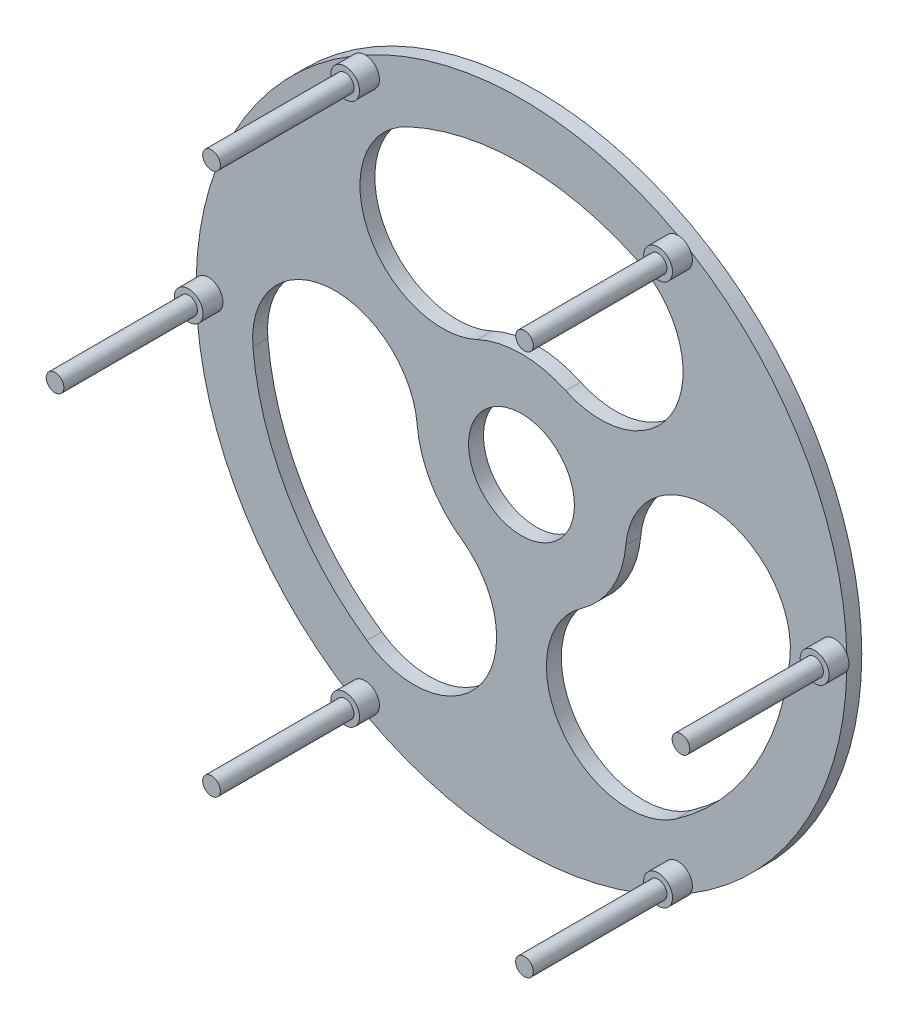
ISO-10303-21;
HEADER;
FILE_DESCRIPTION(('STEP AP214'),'2;1');
FILE_NAME('part.step','',(''),(''),'','','');
FILE_SCHEMA(('AUTOMOTIVE_DESIGN { 1 0 10303 214 1 1 1 1 }'));
ENDSEC;
DATA;
#1=APPLICATION_CONTEXT('core data for automotive mechanical design processes');
#2=APPLICATION_PROTOCOL_DEFINITION('international standard','automotive_design',2000,#1);
#3=PRODUCT_CONTEXT('',#1,'mechanical');
#4=PRODUCT('Part','Part','',(#3));
#5=PRODUCT_RELATED_PRODUCT_CATEGORY('part','',(#4));
#6=PRODUCT_DEFINITION_FORMATION('','',#4);
#7=PRODUCT_DEFINITION_CONTEXT('part definition',#1,'design');
#8=PRODUCT_DEFINITION('design','',#6,#7);
#9=PRODUCT_DEFINITION_SHAPE('','',#8);
#10=(LENGTH_UNIT() NAMED_UNIT(*) SI_UNIT(.MILLI.,.METRE.));
#11=(NAMED_UNIT(*) PLANE_ANGLE_UNIT() SI_UNIT($,.RADIAN.));
#12=(NAMED_UNIT(*) SI_UNIT($,.STERADIAN.) SOLID_ANGLE_UNIT());
#13=UNCERTAINTY_MEASURE_WITH_UNIT(LENGTH_MEASURE(1.E-05),#10,'distance_accuracy_value','');
#14=(GEOMETRIC_REPRESENTATION_CONTEXT(3) GLOBAL_UNCERTAINTY_ASSIGNED_CONTEXT((#13)) GLOBAL_UNIT_ASSIGNED_CONTEXT((#10,
#11,#12)) REPRESENTATION_CONTEXT('',''));
#15=CARTESIAN_POINT('',(0.,0.,0.));
#16=DIRECTION('',(0.,0.,1.));
#17=DIRECTION('',(1.,0.,0.));
#18=AXIS2_PLACEMENT_3D('',#15,#16,#17);
#19=CARTESIAN_POINT('',(0.,0.,-3.));
#20=DIRECTION('',(0.,0.,1.));
#21=DIRECTION('',(1.,0.,0.));
#22=AXIS2_PLACEMENT_3D('',#19,#20,#21);
#23=CYLINDRICAL_SURFACE('',#22,65.5);
#24=CARTESIAN_POINT('',(0.,0.,-3.));
#25=DIRECTION('',(0.,0.,1.));
#26=DIRECTION('',(1.,0.,0.));
#27=AXIS2_PLACEMENT_3D('',#24,#25,#26);
#28=CIRCLE('',#27,65.5);
#29=CARTESIAN_POINT('',(65.5,0.,-3.));
#30=VERTEX_POINT('',#29);
#31=EDGE_CURVE('E342',#30,#30,#28,.T.);
#32=ORIENTED_EDGE('',*,*,#31,.T.);
#33=EDGE_LOOP('',(#32));
#34=FACE_BOUND('',#33,.T.);
#35=CARTESIAN_POINT('',(0.,0.,0.));
#36=DIRECTION('',(0.,0.,1.));
#37=DIRECTION('',(1.,0.,0.));
#38=AXIS2_PLACEMENT_3D('',#35,#36,#37);
#39=CIRCLE('',#38,65.5);
#40=CARTESIAN_POINT('',(-31.4437131534258,57.4590541440171,0.));
#41=VERTEX_POINT('',#40);
#42=CARTESIAN_POINT('',(-34.0391439894314,55.9605814521862,0.));
#43=VERTEX_POINT('',#42);
#44=EDGE_CURVE('E345',#41,#43,#39,.T.);
#45=ORIENTED_EDGE('',*,*,#44,.F.);
#46=CARTESIAN_POINT('',(31.4437131534258,57.4590541440171,0.));
#47=VERTEX_POINT('',#46);
#48=EDGE_CURVE('E338',#47,#41,#39,.T.);
#49=ORIENTED_EDGE('',*,*,#48,.F.);
#50=CARTESIAN_POINT('',(34.0391439894314,55.9605814521862,0.));
#51=VERTEX_POINT('',#50);
#52=EDGE_CURVE('E380',#51,#47,#39,.T.);
#53=ORIENTED_EDGE('',*,*,#52,.F.);
#54=CARTESIAN_POINT('',(65.4828571428572,1.49847269183087,0.));
#55=VERTEX_POINT('',#54);
#56=EDGE_CURVE('E349',#55,#51,#39,.T.);
#57=ORIENTED_EDGE('',*,*,#56,.F.);
#58=CARTESIAN_POINT('',(65.4828571428572,-1.49847269183086,0.));
#59=VERTEX_POINT('',#58);
#60=EDGE_CURVE('E378',#59,#55,#39,.T.);
#61=ORIENTED_EDGE('',*,*,#60,.F.);
#62=CARTESIAN_POINT('',(34.0391439894319,-55.9605814521858,0.));
#63=VERTEX_POINT('',#62);
#64=EDGE_CURVE('E366',#63,#59,#39,.T.);
#65=ORIENTED_EDGE('',*,*,#64,.F.);
#66=CARTESIAN_POINT('',(31.4437131534253,-57.4590541440171,0.));
#67=VERTEX_POINT('',#66);
#68=EDGE_CURVE('E375',#67,#63,#39,.T.);
#69=ORIENTED_EDGE('',*,*,#68,.F.);
#70=CARTESIAN_POINT('',(-31.4437131534253,-57.4590541440173,0.));
#71=VERTEX_POINT('',#70);
#72=EDGE_CURVE('E367',#71,#67,#39,.T.);
#73=ORIENTED_EDGE('',*,*,#72,.F.);
#74=CARTESIAN_POINT('',(-34.0391439894317,-55.9605814521857,0.));
#75=VERTEX_POINT('',#74);
#76=EDGE_CURVE('E394',#75,#71,#39,.T.);
#77=ORIENTED_EDGE('',*,*,#76,.F.);
#78=CARTESIAN_POINT('',(-65.4828571428571,-1.49847269183145,0.));
#79=VERTEX_POINT('',#78);
#80=EDGE_CURVE('E390',#79,#75,#39,.T.);
#81=ORIENTED_EDGE('',*,*,#80,.F.);
#82=CARTESIAN_POINT('',(-65.482857142857,1.49847269183132,0.));
#83=VERTEX_POINT('',#82);
#84=EDGE_CURVE('E386',#83,#79,#39,.T.);
#85=ORIENTED_EDGE('',*,*,#84,.F.);
#86=EDGE_CURVE('E348',#43,#83,#39,.T.);
#87=ORIENTED_EDGE('',*,*,#86,.F.);
#88=EDGE_LOOP('',(#45,#49,#53,#57,#61,#65,#69,#73,#77,#81,#85,#87));
#89=FACE_BOUND('',#88,.T.);
#90=ADVANCED_FACE('F41',(#34,#89),#23,.T.);
#91=CARTESIAN_POINT('',(0.,0.,-3.));
#92=DIRECTION('',(0.,0.,1.));
#93=DIRECTION('',(1.,0.,0.));
#94=AXIS2_PLACEMENT_3D('',#91,#92,#93);
#95=PLANE('',#94);
#96=CARTESIAN_POINT('',(0.,0.,-3.));
#97=DIRECTION('',(0.,0.,-1.));
#98=DIRECTION('',(1.,0.,0.));
#99=AXIS2_PLACEMENT_3D('',#96,#97,#98);
#100=CIRCLE('',#99,21.0713051543318);
#101=CARTESIAN_POINT('',(-8.90511835693149,19.0970879443964,-3.));
#102=VERTEX_POINT('',#101);
#103=CARTESIAN_POINT('',(8.9051183569315,19.0970879443964,-3.));
#104=VERTEX_POINT('',#103);
#105=EDGE_CURVE('E179',#102,#104,#100,.T.);
#106=ORIENTED_EDGE('',*,*,#105,.T.);
#107=CARTESIAN_POINT('',(15.9206309853819,34.1419033270305,-3.));
#108=DIRECTION('',(0.,0.,1.));
#109=DIRECTION('',(1.,0.,0.));
#110=AXIS2_PLACEMENT_3D('',#107,#108,#109);
#111=CIRCLE('',#110,16.6001170880658);
#112=CARTESIAN_POINT('',(22.9361436138321,49.1867187096649,-3.));
#113=VERTEX_POINT('',#112);
#114=EDGE_CURVE('E171',#104,#113,#111,.T.);
#115=ORIENTED_EDGE('',*,*,#114,.T.);
#116=CARTESIAN_POINT('',(0.,0.,-3.));
#117=DIRECTION('',(0.,0.,1.));
#118=DIRECTION('',(1.,0.,0.));
#119=AXIS2_PLACEMENT_3D('',#116,#117,#118);
#120=CIRCLE('',#119,54.2715393304633);
#121=CARTESIAN_POINT('',(-22.9361436138321,49.1867187096649,-3.));
#122=VERTEX_POINT('',#121);
#123=EDGE_CURVE('E182',#113,#122,#120,.T.);
#124=ORIENTED_EDGE('',*,*,#123,.T.);
#125=CARTESIAN_POINT('',(-15.9206309853818,34.1419033270306,-3.));
#126=DIRECTION('',(0.,0.,1.));
#127=DIRECTION('',(1.,0.,0.));
#128=AXIS2_PLACEMENT_3D('',#125,#126,#127);
#129=CIRCLE('',#128,16.6001170880658);
#130=EDGE_CURVE('E57',#122,#102,#129,.T.);
#131=ORIENTED_EDGE('',*,*,#130,.T.);
#132=EDGE_LOOP('',(#106,#115,#124,#131));
#133=FACE_BOUND('',#132,.T.);
#134=CARTESIAN_POINT('',(21.6074401220698,-30.8586225411338,-3.));
#135=DIRECTION('',(0.,0.,1.));
#136=DIRECTION('',(1.,0.,0.));
#137=AXIS2_PLACEMENT_3D('',#134,#135,#136);
#138=CIRCLE('',#137,16.6001170880655);
#139=CARTESIAN_POINT('',(12.086004119688,-17.2606026930077,-3.));
#140=VERTEX_POINT('',#139);
#141=CARTESIAN_POINT('',(31.1288761244527,-44.4566423892592,-3.));
#142=VERTEX_POINT('',#141);
#143=EDGE_CURVE('E212',#140,#142,#138,.T.);
#144=ORIENTED_EDGE('',*,*,#143,.T.);
#145=CARTESIAN_POINT('',(0.,0.,-3.));
#146=DIRECTION('',(0.,0.,1.));
#147=DIRECTION('',(1.,0.,0.));
#148=AXIS2_PLACEMENT_3D('',#145,#146,#147);
#149=CIRCLE('',#148,54.2715393304639);
#150=CARTESIAN_POINT('',(54.0650197382862,-4.73007632040555,-3.));
#151=VERTEX_POINT('',#150);
#152=EDGE_CURVE('E224',#142,#151,#149,.T.);
#153=ORIENTED_EDGE('',*,*,#152,.T.);
#154=CARTESIAN_POINT('',(37.5280711074529,-3.28328078589675,-3.));
#155=DIRECTION('',(0.,0.,1.));
#156=DIRECTION('',(1.,0.,0.));
#157=AXIS2_PLACEMENT_3D('',#154,#155,#156);
#158=CIRCLE('',#157,16.6001170880658);
#159=CARTESIAN_POINT('',(20.9911224766196,-1.83648525138829,-3.));
#160=VERTEX_POINT('',#159);
#161=EDGE_CURVE('E234',#151,#160,#158,.T.);
#162=ORIENTED_EDGE('',*,*,#161,.T.);
#163=CARTESIAN_POINT('',(0.,0.,-3.));
#164=DIRECTION('',(0.,0.,-1.));
#165=DIRECTION('',(1.,0.,0.));
#166=AXIS2_PLACEMENT_3D('',#163,#164,#165);
#167=CIRCLE('',#166,21.0713051543326);
#168=EDGE_CURVE('E65',#160,#140,#167,.T.);
#169=ORIENTED_EDGE('',*,*,#168,.T.);
#170=EDGE_LOOP('',(#144,#153,#162,#169));
#171=FACE_BOUND('',#170,.T.);
#172=CARTESIAN_POINT('',(-37.5280711074512,-3.28328078589767,-3.));
#173=DIRECTION('',(0.,0.,1.));
#174=DIRECTION('',(1.,0.,0.));
#175=AXIS2_PLACEMENT_3D('',#172,#173,#174);
#176=CIRCLE('',#175,16.6001170880661);
#177=CARTESIAN_POINT('',(-20.9911224766176,-1.83648525138926,-3.));
#178=VERTEX_POINT('',#177);
#179=CARTESIAN_POINT('',(-54.0650197382849,-4.73007632040532,-3.));
#180=VERTEX_POINT('',#179);
#181=EDGE_CURVE('E242',#178,#180,#176,.T.);
#182=ORIENTED_EDGE('',*,*,#181,.T.);
#183=CARTESIAN_POINT('',(0.,0.,-3.));
#184=DIRECTION('',(0.,0.,1.));
#185=DIRECTION('',(1.,0.,0.));
#186=AXIS2_PLACEMENT_3D('',#183,#184,#185);
#187=CIRCLE('',#186,54.2715393304635);
#188=CARTESIAN_POINT('',(-31.1288761244524,-44.4566423892601,-3.));
#189=VERTEX_POINT('',#188);
#190=EDGE_CURVE('E253',#180,#189,#187,.T.);
#191=ORIENTED_EDGE('',*,*,#190,.T.);
#192=CARTESIAN_POINT('',(-21.6074401220693,-30.8586225411346,-3.));
#193=DIRECTION('',(0.,0.,1.));
#194=DIRECTION('',(1.,0.,0.));
#195=AXIS2_PLACEMENT_3D('',#192,#193,#194);
#196=CIRCLE('',#195,16.6001170880658);
#197=CARTESIAN_POINT('',(-12.0860041196864,-17.2606026930089,-3.));
#198=VERTEX_POINT('',#197);
#199=EDGE_CURVE('E265',#189,#198,#196,.T.);
#200=ORIENTED_EDGE('',*,*,#199,.T.);
#201=CARTESIAN_POINT('',(0.,0.,-3.));
#202=DIRECTION('',(0.,0.,-1.));
#203=DIRECTION('',(1.,0.,0.));
#204=AXIS2_PLACEMENT_3D('',#201,#202,#203);
#205=CIRCLE('',#204,21.0713051543317);
#206=EDGE_CURVE('E262',#198,#178,#205,.T.);
#207=ORIENTED_EDGE('',*,*,#206,.T.);
#208=EDGE_LOOP('',(#182,#191,#200,#207));
#209=FACE_BOUND('',#208,.T.);
#210=CARTESIAN_POINT('',(0.,0.,-3.));
#211=DIRECTION('',(0.,0.,1.));
#212=DIRECTION('',(1.,0.,0.));
#213=AXIS2_PLACEMENT_3D('',#210,#211,#212);
#214=CIRCLE('',#213,10.65);
#215=CARTESIAN_POINT('',(10.65,0.,-3.));
#216=VERTEX_POINT('',#215);
#217=EDGE_CURVE('E302',#216,#216,#214,.T.);
#218=ORIENTED_EDGE('',*,*,#217,.T.);
#219=EDGE_LOOP('',(#218));
#220=FACE_BOUND('',#219,.T.);
#221=ORIENTED_EDGE('',*,*,#31,.F.);
#222=EDGE_LOOP('',(#221));
#223=FACE_BOUND('',#222,.T.);
#224=ADVANCED_FACE('F186',(#133,#171,#209,#220,#223),#95,.F.);
#225=CARTESIAN_POINT('',(0.,0.,0.));
#226=DIRECTION('',(0.,0.,1.));
#227=DIRECTION('',(1.,0.,0.));
#228=AXIS2_PLACEMENT_3D('',#225,#226,#227);
#229=PLANE('',#228);
#230=CARTESIAN_POINT('',(15.9206309853819,34.1419033270305,0.));
#231=DIRECTION('',(0.,0.,1.));
#232=DIRECTION('',(1.,0.,0.));
#233=AXIS2_PLACEMENT_3D('',#230,#231,#232);
#234=CIRCLE('',#233,16.6001170880658);
#235=CARTESIAN_POINT('',(8.9051183569315,19.0970879443964,0.));
#236=VERTEX_POINT('',#235);
#237=CARTESIAN_POINT('',(22.9361436138321,49.1867187096649,0.));
#238=VERTEX_POINT('',#237);
#239=EDGE_CURVE('E174',#236,#238,#234,.T.);
#240=ORIENTED_EDGE('',*,*,#239,.F.);
#241=CARTESIAN_POINT('',(0.,0.,0.));
#242=DIRECTION('',(0.,0.,-1.));
#243=DIRECTION('',(1.,0.,0.));
#244=AXIS2_PLACEMENT_3D('',#241,#242,#243);
#245=CIRCLE('',#244,21.0713051543318);
#246=CARTESIAN_POINT('',(-8.90511835693149,19.0970879443964,0.));
#247=VERTEX_POINT('',#246);
#248=EDGE_CURVE('E189',#247,#236,#245,.T.);
#249=ORIENTED_EDGE('',*,*,#248,.F.);
#250=CARTESIAN_POINT('',(-15.9206309853818,34.1419033270306,0.));
#251=DIRECTION('',(0.,0.,1.));
#252=DIRECTION('',(1.,0.,0.));
#253=AXIS2_PLACEMENT_3D('',#250,#251,#252);
#254=CIRCLE('',#253,16.6001170880658);
#255=CARTESIAN_POINT('',(-22.9361436138321,49.1867187096649,0.));
#256=VERTEX_POINT('',#255);
#257=EDGE_CURVE('E192',#256,#247,#254,.T.);
#258=ORIENTED_EDGE('',*,*,#257,.F.);
#259=CARTESIAN_POINT('',(0.,0.,0.));
#260=DIRECTION('',(0.,0.,1.));
#261=DIRECTION('',(1.,0.,0.));
#262=AXIS2_PLACEMENT_3D('',#259,#260,#261);
#263=CIRCLE('',#262,54.2715393304633);
#264=EDGE_CURVE('E198',#238,#256,#263,.T.);
#265=ORIENTED_EDGE('',*,*,#264,.F.);
#266=EDGE_LOOP('',(#240,#249,#258,#265));
#267=FACE_BOUND('',#266,.T.);
#268=CARTESIAN_POINT('',(0.,0.,0.));
#269=DIRECTION('',(0.,0.,1.));
#270=DIRECTION('',(1.,0.,0.));
#271=AXIS2_PLACEMENT_3D('',#268,#269,#270);
#272=CIRCLE('',#271,54.2715393304639);
#273=CARTESIAN_POINT('',(31.1288761244527,-44.4566423892592,0.));
#274=VERTEX_POINT('',#273);
#275=CARTESIAN_POINT('',(54.0650197382862,-4.73007632040555,0.));
#276=VERTEX_POINT('',#275);
#277=EDGE_CURVE('E199',#274,#276,#272,.T.);
#278=ORIENTED_EDGE('',*,*,#277,.F.);
#279=CARTESIAN_POINT('',(21.6074401220698,-30.8586225411338,0.));
#280=DIRECTION('',(0.,0.,1.));
#281=DIRECTION('',(1.,0.,0.));
#282=AXIS2_PLACEMENT_3D('',#279,#280,#281);
#283=CIRCLE('',#282,16.6001170880655);
#284=CARTESIAN_POINT('',(12.086004119688,-17.2606026930077,0.));
#285=VERTEX_POINT('',#284);
#286=EDGE_CURVE('E220',#285,#274,#283,.T.);
#287=ORIENTED_EDGE('',*,*,#286,.F.);
#288=CARTESIAN_POINT('',(0.,0.,0.));
#289=DIRECTION('',(0.,0.,-1.));
#290=DIRECTION('',(1.,0.,0.));
#291=AXIS2_PLACEMENT_3D('',#288,#289,#290);
#292=CIRCLE('',#291,21.0713051543326);
#293=CARTESIAN_POINT('',(20.9911224766194,-1.83648525138827,0.));
#294=VERTEX_POINT('',#293);
#295=EDGE_CURVE('E223',#294,#285,#292,.T.);
#296=ORIENTED_EDGE('',*,*,#295,.F.);
#297=CARTESIAN_POINT('',(37.5280711074529,-3.28328078589675,0.));
#298=DIRECTION('',(0.,0.,1.));
#299=DIRECTION('',(1.,0.,0.));
#300=AXIS2_PLACEMENT_3D('',#297,#298,#299);
#301=CIRCLE('',#300,16.6001170880658);
#302=EDGE_CURVE('E227',#276,#294,#301,.T.);
#303=ORIENTED_EDGE('',*,*,#302,.F.);
#304=EDGE_LOOP('',(#278,#287,#296,#303));
#305=FACE_BOUND('',#304,.T.);
#306=CARTESIAN_POINT('',(0.,0.,0.));
#307=DIRECTION('',(0.,0.,1.));
#308=DIRECTION('',(1.,0.,0.));
#309=AXIS2_PLACEMENT_3D('',#306,#307,#308);
#310=CIRCLE('',#309,54.2715393304635);
#311=CARTESIAN_POINT('',(-54.0650197382849,-4.73007632040532,0.));
#312=VERTEX_POINT('',#311);
#313=CARTESIAN_POINT('',(-31.1288761244524,-44.4566423892601,0.));
#314=VERTEX_POINT('',#313);
#315=EDGE_CURVE('E219',#312,#314,#310,.T.);
#316=ORIENTED_EDGE('',*,*,#315,.F.);
#317=CARTESIAN_POINT('',(-37.5280711074512,-3.28328078589767,0.));
#318=DIRECTION('',(0.,0.,1.));
#319=DIRECTION('',(1.,0.,0.));
#320=AXIS2_PLACEMENT_3D('',#317,#318,#319);
#321=CIRCLE('',#320,16.6001170880661);
#322=CARTESIAN_POINT('',(-20.9911224766176,-1.83648525138926,0.));
#323=VERTEX_POINT('',#322);
#324=EDGE_CURVE('E249',#323,#312,#321,.T.);
#325=ORIENTED_EDGE('',*,*,#324,.F.);
#326=CARTESIAN_POINT('',(0.,0.,0.));
#327=DIRECTION('',(0.,0.,-1.));
#328=DIRECTION('',(1.,0.,0.));
#329=AXIS2_PLACEMENT_3D('',#326,#327,#328);
#330=CIRCLE('',#329,21.0713051543317);
#331=CARTESIAN_POINT('',(-12.0860041196862,-17.2606026930085,0.));
#332=VERTEX_POINT('',#331);
#333=EDGE_CURVE('E252',#332,#323,#330,.T.);
#334=ORIENTED_EDGE('',*,*,#333,.F.);
#335=CARTESIAN_POINT('',(-21.6074401220693,-30.8586225411346,0.));
#336=DIRECTION('',(0.,0.,1.));
#337=DIRECTION('',(1.,0.,0.));
#338=AXIS2_PLACEMENT_3D('',#335,#336,#337);
#339=CIRCLE('',#338,16.6001170880658);
#340=EDGE_CURVE('E256',#314,#332,#339,.T.);
#341=ORIENTED_EDGE('',*,*,#340,.F.);
#342=EDGE_LOOP('',(#316,#325,#334,#341));
#343=FACE_BOUND('',#342,.T.);
#344=CARTESIAN_POINT('',(0.,0.,0.));
#345=DIRECTION('',(0.,0.,1.));
#346=DIRECTION('',(1.,0.,0.));
#347=AXIS2_PLACEMENT_3D('',#344,#345,#346);
#348=CIRCLE('',#347,10.65);
#349=CARTESIAN_POINT('',(10.65,0.,0.));
#350=VERTEX_POINT('',#349);
#351=EDGE_CURVE('E299',#350,#350,#348,.T.);
#352=ORIENTED_EDGE('',*,*,#351,.F.);
#353=EDGE_LOOP('',(#352));
#354=FACE_BOUND('',#353,.T.);
#355=ORIENTED_EDGE('',*,*,#64,.T.);
#356=CARTESIAN_POINT('',(63.,0.,0.));
#357=DIRECTION('',(0.,0.,1.));
#358=DIRECTION('',(1.,0.,0.));
#359=AXIS2_PLACEMENT_3D('',#356,#357,#358);
#360=CIRCLE('',#359,2.9);
#361=EDGE_CURVE('E308',#55,#59,#360,.T.);
#362=ORIENTED_EDGE('',*,*,#361,.F.);
#363=ORIENTED_EDGE('',*,*,#56,.T.);
#364=CARTESIAN_POINT('',(31.5,54.5596004384197,0.));
#365=DIRECTION('',(0.,0.,1.));
#366=DIRECTION('',(1.,0.,0.));
#367=AXIS2_PLACEMENT_3D('',#364,#365,#366);
#368=CIRCLE('',#367,2.9);
#369=EDGE_CURVE('E350',#51,#47,#368,.F.);
#370=ORIENTED_EDGE('',*,*,#369,.T.);
#371=ORIENTED_EDGE('',*,*,#48,.T.);
#372=CARTESIAN_POINT('',(-31.5,54.5596004384196,0.));
#373=DIRECTION('',(0.,0.,1.));
#374=DIRECTION('',(1.,0.,0.));
#375=AXIS2_PLACEMENT_3D('',#372,#373,#374);
#376=CIRCLE('',#375,2.9);
#377=EDGE_CURVE('E341',#43,#41,#376,.T.);
#378=ORIENTED_EDGE('',*,*,#377,.F.);
#379=ORIENTED_EDGE('',*,*,#86,.T.);
#380=CARTESIAN_POINT('',(-63.,0.,0.));
#381=DIRECTION('',(0.,0.,1.));
#382=DIRECTION('',(1.,0.,0.));
#383=AXIS2_PLACEMENT_3D('',#380,#381,#382);
#384=CIRCLE('',#383,2.9);
#385=EDGE_CURVE('E353',#83,#79,#384,.F.);
#386=ORIENTED_EDGE('',*,*,#385,.T.);
#387=ORIENTED_EDGE('',*,*,#80,.T.);
#388=CARTESIAN_POINT('',(-31.5,-54.5596004384197,0.));
#389=DIRECTION('',(0.,0.,1.));
#390=DIRECTION('',(1.,0.,0.));
#391=AXIS2_PLACEMENT_3D('',#388,#389,#390);
#392=CIRCLE('',#391,2.9);
#393=EDGE_CURVE('E355',#75,#71,#392,.F.);
#394=ORIENTED_EDGE('',*,*,#393,.T.);
#395=ORIENTED_EDGE('',*,*,#72,.T.);
#396=CARTESIAN_POINT('',(31.5,-54.5596004384196,0.));
#397=DIRECTION('',(0.,0.,1.));
#398=DIRECTION('',(1.,0.,0.));
#399=AXIS2_PLACEMENT_3D('',#396,#397,#398);
#400=CIRCLE('',#399,2.9);
#401=EDGE_CURVE('E44',#67,#63,#400,.F.);
#402=ORIENTED_EDGE('',*,*,#401,.T.);
#403=EDGE_LOOP('',(#355,#362,#363,#370,#371,#378,#379,#386,#387,#394,#395,#402));
#404=FACE_BOUND('',#403,.T.);
#405=ADVANCED_FACE('F364',(#267,#305,#343,#354,#404),#229,.T.);
#406=CARTESIAN_POINT('',(-31.5,54.5596004384196,0.));
#407=DIRECTION('',(0.,0.,1.));
#408=DIRECTION('',(1.,0.,0.));
#409=AXIS2_PLACEMENT_3D('',#406,#407,#408);
#410=PLANE('',#409);
#411=EDGE_CURVE('E332',#41,#43,#376,.T.);
#412=ORIENTED_EDGE('',*,*,#411,.F.);
#413=ORIENTED_EDGE('',*,*,#44,.T.);
#414=EDGE_LOOP('',(#412,#413));
#415=FACE_BOUND('',#414,.T.);
#416=ADVANCED_FACE('F405',(#415),#410,.F.);
#417=CARTESIAN_POINT('',(-31.5,54.5596004384196,3.99999999999999));
#418=DIRECTION('',(0.,0.,-1.));
#419=DIRECTION('',(-1.,0.,0.));
#420=AXIS2_PLACEMENT_3D('',#417,#418,#419);
#421=CYLINDRICAL_SURFACE('',#420,2.9);
#422=CARTESIAN_POINT('',(-31.5,54.5596004384196,3.99999999999999));
#423=DIRECTION('',(0.,0.,1.));
#424=DIRECTION('',(1.,0.,0.));
#425=AXIS2_PLACEMENT_3D('',#422,#423,#424);
#426=CIRCLE('',#425,2.9);
#427=CARTESIAN_POINT('',(-28.6,54.5596004384196,3.99999999999999));
#428=VERTEX_POINT('',#427);
#429=EDGE_CURVE('E335',#428,#428,#426,.T.);
#430=ORIENTED_EDGE('',*,*,#429,.F.);
#431=EDGE_LOOP('',(#430));
#432=FACE_BOUND('',#431,.T.);
#433=ORIENTED_EDGE('',*,*,#411,.T.);
#434=ORIENTED_EDGE('',*,*,#377,.T.);
#435=EDGE_LOOP('',(#433,#434));
#436=FACE_BOUND('',#435,.T.);
#437=ADVANCED_FACE('F407',(#432,#436),#421,.T.);
#438=CARTESIAN_POINT('',(-31.5,54.5596004384196,3.99999999999999));
#439=DIRECTION('',(0.,0.,1.));
#440=DIRECTION('',(1.,0.,0.));
#441=AXIS2_PLACEMENT_3D('',#438,#439,#440);
#442=PLANE('',#441);
#443=CARTESIAN_POINT('',(-31.5,54.5596004384197,3.99999999999999));
#444=DIRECTION('',(0.,0.,1.));
#445=DIRECTION('',(1.,0.,0.));
#446=AXIS2_PLACEMENT_3D('',#443,#444,#445);
#447=CIRCLE('',#446,1.7771775485794);
#448=CARTESIAN_POINT('',(-29.7228224514206,54.5596004384197,3.99999999999999));
#449=VERTEX_POINT('',#448);
#450=EDGE_CURVE('E293',#449,#449,#447,.T.);
#451=ORIENTED_EDGE('',*,*,#450,.F.);
#452=EDGE_LOOP('',(#451));
#453=FACE_BOUND('',#452,.T.);
#454=ORIENTED_EDGE('',*,*,#429,.T.);
#455=EDGE_LOOP('',(#454));
#456=FACE_BOUND('',#455,.T.);
#457=ADVANCED_FACE('F443',(#453,#456),#442,.T.);
#458=CARTESIAN_POINT('',(31.5,54.5596004384197,3.99999999999999));
#459=DIRECTION('',(0.,0.,-1.));
#460=DIRECTION('',(-1.,0.,0.));
#461=AXIS2_PLACEMENT_3D('',#458,#459,#460);
#462=CYLINDRICAL_SURFACE('',#461,2.9);
#463=CARTESIAN_POINT('',(31.5,54.5596004384197,3.99999999999999));
#464=DIRECTION('',(0.,0.,1.));
#465=DIRECTION('',(1.,0.,0.));
#466=AXIS2_PLACEMENT_3D('',#463,#464,#465);
#467=CIRCLE('',#466,2.9);
#468=CARTESIAN_POINT('',(34.4,54.5596004384197,3.99999999999999));
#469=VERTEX_POINT('',#468);
#470=EDGE_CURVE('E327',#469,#469,#467,.T.);
#471=ORIENTED_EDGE('',*,*,#470,.F.);
#472=EDGE_LOOP('',(#471));
#473=FACE_BOUND('',#472,.T.);
#474=CARTESIAN_POINT('',(31.5,54.5596004384197,0.));
#475=DIRECTION('',(0.,0.,1.));
#476=DIRECTION('',(1.,0.,0.));
#477=AXIS2_PLACEMENT_3D('',#474,#475,#476);
#478=CIRCLE('',#477,2.9);
#479=EDGE_CURVE('E330',#51,#47,#478,.T.);
#480=ORIENTED_EDGE('',*,*,#479,.T.);
#481=ORIENTED_EDGE('',*,*,#369,.F.);
#482=EDGE_LOOP('',(#480,#481));
#483=FACE_BOUND('',#482,.T.);
#484=ADVANCED_FACE('F409',(#473,#483),#462,.T.);
#485=CARTESIAN_POINT('',(31.5,54.5596004384197,3.99999999999999));
#486=DIRECTION('',(0.,0.,1.));
#487=DIRECTION('',(1.,0.,0.));
#488=AXIS2_PLACEMENT_3D('',#485,#486,#487);
#489=PLANE('',#488);
#490=CARTESIAN_POINT('',(31.5000000000002,54.5596004384196,3.99999999999999));
#491=DIRECTION('',(0.,0.,1.));
#492=DIRECTION('',(1.,0.,0.));
#493=AXIS2_PLACEMENT_3D('',#490,#491,#492);
#494=CIRCLE('',#493,1.77717754857941);
#495=CARTESIAN_POINT('',(33.2771775485796,54.5596004384196,3.99999999999999));
#496=VERTEX_POINT('',#495);
#497=EDGE_CURVE('E287',#496,#496,#494,.T.);
#498=ORIENTED_EDGE('',*,*,#497,.F.);
#499=EDGE_LOOP('',(#498));
#500=FACE_BOUND('',#499,.T.);
#501=ORIENTED_EDGE('',*,*,#470,.T.);
#502=EDGE_LOOP('',(#501));
#503=FACE_BOUND('',#502,.T.);
#504=ADVANCED_FACE('F413',(#500,#503),#489,.T.);
#505=CARTESIAN_POINT('',(31.5,54.5596004384197,0.));
#506=DIRECTION('',(0.,0.,1.));
#507=DIRECTION('',(1.,0.,0.));
#508=AXIS2_PLACEMENT_3D('',#505,#506,#507);
#509=PLANE('',#508);
#510=ORIENTED_EDGE('',*,*,#52,.T.);
#511=ORIENTED_EDGE('',*,*,#479,.F.);
#512=EDGE_LOOP('',(#510,#511));
#513=FACE_BOUND('',#512,.T.);
#514=ADVANCED_FACE('F410',(#513),#509,.F.);
#515=CARTESIAN_POINT('',(-63.,0.,3.99999999999999));
#516=DIRECTION('',(0.,0.,-1.));
#517=DIRECTION('',(-1.,0.,0.));
#518=AXIS2_PLACEMENT_3D('',#515,#516,#517);
#519=CYLINDRICAL_SURFACE('',#518,2.9);
#520=CARTESIAN_POINT('',(-63.,0.,3.99999999999999));
#521=DIRECTION('',(0.,0.,1.));
#522=DIRECTION('',(1.,0.,0.));
#523=AXIS2_PLACEMENT_3D('',#520,#521,#522);
#524=CIRCLE('',#523,2.9);
#525=CARTESIAN_POINT('',(-60.1,0.,3.99999999999999));
#526=VERTEX_POINT('',#525);
#527=EDGE_CURVE('E322',#526,#526,#524,.T.);
#528=ORIENTED_EDGE('',*,*,#527,.F.);
#529=EDGE_LOOP('',(#528));
#530=FACE_BOUND('',#529,.T.);
#531=CARTESIAN_POINT('',(-63.,0.,0.));
#532=DIRECTION('',(0.,0.,1.));
#533=DIRECTION('',(1.,0.,0.));
#534=AXIS2_PLACEMENT_3D('',#531,#532,#533);
#535=CIRCLE('',#534,2.9);
#536=EDGE_CURVE('E325',#83,#79,#535,.T.);
#537=ORIENTED_EDGE('',*,*,#536,.T.);
#538=ORIENTED_EDGE('',*,*,#385,.F.);
#539=EDGE_LOOP('',(#537,#538));
#540=FACE_BOUND('',#539,.T.);
#541=ADVANCED_FACE('F412',(#530,#540),#519,.T.);
#542=CARTESIAN_POINT('',(-63.,0.,3.99999999999999));
#543=DIRECTION('',(0.,0.,1.));
#544=DIRECTION('',(1.,0.,0.));
#545=AXIS2_PLACEMENT_3D('',#542,#543,#544);
#546=PLANE('',#545);
#547=CARTESIAN_POINT('',(-63.,7.3899220076612E-13,3.99999999999999));
#548=DIRECTION('',(0.,0.,1.));
#549=DIRECTION('',(1.,0.,0.));
#550=AXIS2_PLACEMENT_3D('',#547,#548,#549);
#551=CIRCLE('',#550,1.77717754857941);
#552=CARTESIAN_POINT('',(-61.2228224514206,7.3899220076612E-13,3.99999999999999));
#553=VERTEX_POINT('',#552);
#554=EDGE_CURVE('E11',#553,#553,#551,.T.);
#555=ORIENTED_EDGE('',*,*,#554,.F.);
#556=EDGE_LOOP('',(#555));
#557=FACE_BOUND('',#556,.T.);
#558=ORIENTED_EDGE('',*,*,#527,.T.);
#559=EDGE_LOOP('',(#558));
#560=FACE_BOUND('',#559,.T.);
#561=ADVANCED_FACE('F419',(#557,#560),#546,.T.);
#562=CARTESIAN_POINT('',(-63.,0.,0.));
#563=DIRECTION('',(0.,0.,1.));
#564=DIRECTION('',(1.,0.,0.));
#565=AXIS2_PLACEMENT_3D('',#562,#563,#564);
#566=PLANE('',#565);
#567=ORIENTED_EDGE('',*,*,#84,.T.);
#568=ORIENTED_EDGE('',*,*,#536,.F.);
#569=EDGE_LOOP('',(#567,#568));
#570=FACE_BOUND('',#569,.T.);
#571=ADVANCED_FACE('F500',(#570),#566,.F.);
#572=CARTESIAN_POINT('',(-31.5,-54.5596004384197,3.99999999999999));
#573=DIRECTION('',(0.,0.,-1.));
#574=DIRECTION('',(-1.,0.,0.));
#575=AXIS2_PLACEMENT_3D('',#572,#573,#574);
#576=CYLINDRICAL_SURFACE('',#575,2.9);
#577=CARTESIAN_POINT('',(-31.5,-54.5596004384197,3.99999999999999));
#578=DIRECTION('',(0.,0.,1.));
#579=DIRECTION('',(1.,0.,0.));
#580=AXIS2_PLACEMENT_3D('',#577,#578,#579);
#581=CIRCLE('',#580,2.9);
#582=CARTESIAN_POINT('',(-28.6,-54.5596004384197,3.99999999999999));
#583=VERTEX_POINT('',#582);
#584=EDGE_CURVE('E317',#583,#583,#581,.T.);
#585=ORIENTED_EDGE('',*,*,#584,.F.);
#586=EDGE_LOOP('',(#585));
#587=FACE_BOUND('',#586,.T.);
#588=CARTESIAN_POINT('',(-31.5,-54.5596004384197,0.));
#589=DIRECTION('',(0.,0.,1.));
#590=DIRECTION('',(1.,0.,0.));
#591=AXIS2_PLACEMENT_3D('',#588,#589,#590);
#592=CIRCLE('',#591,2.9);
#593=EDGE_CURVE('E320',#75,#71,#592,.T.);
#594=ORIENTED_EDGE('',*,*,#593,.T.);
#595=ORIENTED_EDGE('',*,*,#393,.F.);
#596=EDGE_LOOP('',(#594,#595));
#597=FACE_BOUND('',#596,.T.);
#598=ADVANCED_FACE('F496',(#587,#597),#576,.T.);
#599=CARTESIAN_POINT('',(-31.5,-54.5596004384197,3.99999999999999));
#600=DIRECTION('',(0.,0.,1.));
#601=DIRECTION('',(1.,0.,0.));
#602=AXIS2_PLACEMENT_3D('',#599,#600,#601);
#603=PLANE('',#602);
#604=CARTESIAN_POINT('',(-31.5000000000005,-54.5596004384194,3.99999999999999));
#605=DIRECTION('',(0.,0.,1.));
#606=DIRECTION('',(1.,0.,0.));
#607=AXIS2_PLACEMENT_3D('',#604,#605,#606);
#608=CIRCLE('',#607,1.77717754857941);
#609=CARTESIAN_POINT('',(-29.7228224514211,-54.5596004384194,3.99999999999999));
#610=VERTEX_POINT('',#609);
#611=EDGE_CURVE('E49',#610,#610,#608,.T.);
#612=ORIENTED_EDGE('',*,*,#611,.F.);
#613=EDGE_LOOP('',(#612));
#614=FACE_BOUND('',#613,.T.);
#615=ORIENTED_EDGE('',*,*,#584,.T.);
#616=EDGE_LOOP('',(#615));
#617=FACE_BOUND('',#616,.T.);
#618=ADVANCED_FACE('F499',(#614,#617),#603,.T.);
#619=CARTESIAN_POINT('',(-31.5,-54.5596004384197,0.));
#620=DIRECTION('',(0.,0.,1.));
#621=DIRECTION('',(1.,0.,0.));
#622=AXIS2_PLACEMENT_3D('',#619,#620,#621);
#623=PLANE('',#622);
#624=ORIENTED_EDGE('',*,*,#76,.T.);
#625=ORIENTED_EDGE('',*,*,#593,.F.);
#626=EDGE_LOOP('',(#624,#625));
#627=FACE_BOUND('',#626,.T.);
#628=ADVANCED_FACE('F400',(#627),#623,.F.);
#629=CARTESIAN_POINT('',(31.5,-54.5596004384196,3.99999999999999));
#630=DIRECTION('',(0.,0.,-1.));
#631=DIRECTION('',(-1.,0.,0.));
#632=AXIS2_PLACEMENT_3D('',#629,#630,#631);
#633=CYLINDRICAL_SURFACE('',#632,2.9);
#634=CARTESIAN_POINT('',(31.5,-54.5596004384196,3.99999999999999));
#635=DIRECTION('',(0.,0.,1.));
#636=DIRECTION('',(1.,0.,0.));
#637=AXIS2_PLACEMENT_3D('',#634,#635,#636);
#638=CIRCLE('',#637,2.9);
#639=CARTESIAN_POINT('',(34.4,-54.5596004384196,3.99999999999999));
#640=VERTEX_POINT('',#639);
#641=EDGE_CURVE('E311',#640,#640,#638,.T.);
#642=ORIENTED_EDGE('',*,*,#641,.F.);
#643=EDGE_LOOP('',(#642));
#644=FACE_BOUND('',#643,.T.);
#645=CARTESIAN_POINT('',(31.5,-54.5596004384196,0.));
#646=DIRECTION('',(0.,0.,1.));
#647=DIRECTION('',(1.,0.,0.));
#648=AXIS2_PLACEMENT_3D('',#645,#646,#647);
#649=CIRCLE('',#648,2.9);
#650=EDGE_CURVE('E315',#67,#63,#649,.T.);
#651=ORIENTED_EDGE('',*,*,#650,.T.);
#652=ORIENTED_EDGE('',*,*,#401,.F.);
#653=EDGE_LOOP('',(#651,#652));
#654=FACE_BOUND('',#653,.T.);
#655=ADVANCED_FACE('F485',(#644,#654),#633,.T.);
#656=CARTESIAN_POINT('',(31.5,-54.5596004384196,3.99999999999999));
#657=DIRECTION('',(0.,0.,1.));
#658=DIRECTION('',(1.,0.,0.));
#659=AXIS2_PLACEMENT_3D('',#656,#657,#658);
#660=PLANE('',#659);
#661=CARTESIAN_POINT('',(31.4999999999996,-54.5596004384199,3.99999999999999));
#662=DIRECTION('',(0.,0.,1.));
#663=DIRECTION('',(1.,0.,0.));
#664=AXIS2_PLACEMENT_3D('',#661,#662,#663);
#665=CIRCLE('',#664,1.7771775485794);
#666=CARTESIAN_POINT('',(33.277177548579,-54.5596004384199,3.99999999999999));
#667=VERTEX_POINT('',#666);
#668=EDGE_CURVE('E275',#667,#667,#665,.T.);
#669=ORIENTED_EDGE('',*,*,#668,.F.);
#670=EDGE_LOOP('',(#669));
#671=FACE_BOUND('',#670,.T.);
#672=ORIENTED_EDGE('',*,*,#641,.T.);
#673=EDGE_LOOP('',(#672));
#674=FACE_BOUND('',#673,.T.);
#675=ADVANCED_FACE('F488',(#671,#674),#660,.T.);
#676=CARTESIAN_POINT('',(31.5,-54.5596004384196,0.));
#677=DIRECTION('',(0.,0.,1.));
#678=DIRECTION('',(1.,0.,0.));
#679=AXIS2_PLACEMENT_3D('',#676,#677,#678);
#680=PLANE('',#679);
#681=ORIENTED_EDGE('',*,*,#68,.T.);
#682=ORIENTED_EDGE('',*,*,#650,.F.);
#683=EDGE_LOOP('',(#681,#682));
#684=FACE_BOUND('',#683,.T.);
#685=ADVANCED_FACE('F479',(#684),#680,.F.);
#686=CARTESIAN_POINT('',(63.,0.,3.99999999999999));
#687=DIRECTION('',(0.,0.,-1.));
#688=DIRECTION('',(-1.,0.,0.));
#689=AXIS2_PLACEMENT_3D('',#686,#687,#688);
#690=CYLINDRICAL_SURFACE('',#689,2.9);
#691=CARTESIAN_POINT('',(63.,0.,3.99999999999999));
#692=DIRECTION('',(0.,0.,1.));
#693=DIRECTION('',(1.,0.,0.));
#694=AXIS2_PLACEMENT_3D('',#691,#692,#693);
#695=CIRCLE('',#694,2.9);
#696=CARTESIAN_POINT('',(65.9,0.,3.99999999999999));
#697=VERTEX_POINT('',#696);
#698=EDGE_CURVE('E305',#697,#697,#695,.T.);
#699=ORIENTED_EDGE('',*,*,#698,.F.);
#700=EDGE_LOOP('',(#699));
#701=FACE_BOUND('',#700,.T.);
#702=ORIENTED_EDGE('',*,*,#361,.T.);
#703=EDGE_CURVE('E312',#59,#55,#360,.T.);
#704=ORIENTED_EDGE('',*,*,#703,.T.);
#705=EDGE_LOOP('',(#702,#704));
#706=FACE_BOUND('',#705,.T.);
#707=ADVANCED_FACE('F475',(#701,#706),#690,.T.);
#708=CARTESIAN_POINT('',(63.,0.,3.99999999999999));
#709=DIRECTION('',(0.,0.,1.));
#710=DIRECTION('',(1.,0.,0.));
#711=AXIS2_PLACEMENT_3D('',#708,#709,#710);
#712=PLANE('',#711);
#713=CARTESIAN_POINT('',(63.,-3.19189119579733E-13,3.99999999999999));
#714=DIRECTION('',(0.,0.,1.));
#715=DIRECTION('',(1.,0.,0.));
#716=AXIS2_PLACEMENT_3D('',#713,#714,#715);
#717=CIRCLE('',#716,1.7771775485794);
#718=CARTESIAN_POINT('',(64.7771775485794,-3.19189119579733E-13,3.99999999999999));
#719=VERTEX_POINT('',#718);
#720=EDGE_CURVE('E281',#719,#719,#717,.T.);
#721=ORIENTED_EDGE('',*,*,#720,.F.);
#722=EDGE_LOOP('',(#721));
#723=FACE_BOUND('',#722,.T.);
#724=ORIENTED_EDGE('',*,*,#698,.T.);
#725=EDGE_LOOP('',(#724));
#726=FACE_BOUND('',#725,.T.);
#727=ADVANCED_FACE('F478',(#723,#726),#712,.T.);
#728=CARTESIAN_POINT('',(63.,0.,0.));
#729=DIRECTION('',(0.,0.,1.));
#730=DIRECTION('',(1.,0.,0.));
#731=AXIS2_PLACEMENT_3D('',#728,#729,#730);
#732=PLANE('',#731);
#733=ORIENTED_EDGE('',*,*,#60,.T.);
#734=ORIENTED_EDGE('',*,*,#703,.F.);
#735=EDGE_LOOP('',(#733,#734));
#736=FACE_BOUND('',#735,.T.);
#737=ADVANCED_FACE('F469',(#736),#732,.F.);
#738=CARTESIAN_POINT('',(0.,0.,-3.));
#739=DIRECTION('',(0.,0.,1.));
#740=DIRECTION('',(1.,0.,0.));
#741=AXIS2_PLACEMENT_3D('',#738,#739,#740);
#742=CYLINDRICAL_SURFACE('',#741,10.65);
#743=ORIENTED_EDGE('',*,*,#217,.F.);
#744=EDGE_LOOP('',(#743));
#745=FACE_BOUND('',#744,.T.);
#746=ORIENTED_EDGE('',*,*,#351,.T.);
#747=EDGE_LOOP('',(#746));
#748=FACE_BOUND('',#747,.T.);
#749=ADVANCED_FACE('F459',(#745,#748),#742,.F.);
#750=CARTESIAN_POINT('',(-31.5,54.5596004384197,30.9));
#751=DIRECTION('',(0.,0.,-1.));
#752=DIRECTION('',(-1.,0.,0.));
#753=AXIS2_PLACEMENT_3D('',#750,#751,#752);
#754=CYLINDRICAL_SURFACE('',#753,1.7771775485794);
#755=CARTESIAN_POINT('',(-31.5,54.5596004384197,30.9));
#756=DIRECTION('',(0.,0.,1.));
#757=DIRECTION('',(1.,0.,0.));
#758=AXIS2_PLACEMENT_3D('',#755,#756,#757);
#759=CIRCLE('',#758,1.7771775485794);
#760=CARTESIAN_POINT('',(-29.7228224514206,54.5596004384197,30.9));
#761=VERTEX_POINT('',#760);
#762=EDGE_CURVE('E296',#761,#761,#759,.T.);
#763=ORIENTED_EDGE('',*,*,#762,.F.);
#764=EDGE_LOOP('',(#763));
#765=FACE_BOUND('',#764,.T.);
#766=ORIENTED_EDGE('',*,*,#450,.T.);
#767=EDGE_LOOP('',(#766));
#768=FACE_BOUND('',#767,.T.);
#769=ADVANCED_FACE('F456',(#765,#768),#754,.T.);
#770=CARTESIAN_POINT('',(-31.5,54.5596004384197,30.9));
#771=DIRECTION('',(0.,0.,1.));
#772=DIRECTION('',(1.,0.,0.));
#773=AXIS2_PLACEMENT_3D('',#770,#771,#772);
#774=PLANE('',#773);
#775=ORIENTED_EDGE('',*,*,#762,.T.);
#776=EDGE_LOOP('',(#775));
#777=FACE_BOUND('',#776,.T.);
#778=ADVANCED_FACE('F458',(#777),#774,.T.);
#779=CARTESIAN_POINT('',(31.5000000000002,54.5596004384196,30.9));
#780=DIRECTION('',(0.,0.,-1.));
#781=DIRECTION('',(-1.,0.,0.));
#782=AXIS2_PLACEMENT_3D('',#779,#780,#781);
#783=CYLINDRICAL_SURFACE('',#782,1.77717754857941);
#784=CARTESIAN_POINT('',(31.5000000000002,54.5596004384196,30.9));
#785=DIRECTION('',(0.,0.,1.));
#786=DIRECTION('',(1.,0.,0.));
#787=AXIS2_PLACEMENT_3D('',#784,#785,#786);
#788=CIRCLE('',#787,1.77717754857941);
#789=CARTESIAN_POINT('',(33.2771775485796,54.5596004384196,30.9));
#790=VERTEX_POINT('',#789);
#791=EDGE_CURVE('E290',#790,#790,#788,.T.);
#792=ORIENTED_EDGE('',*,*,#791,.F.);
#793=EDGE_LOOP('',(#792));
#794=FACE_BOUND('',#793,.T.);
#795=ORIENTED_EDGE('',*,*,#497,.T.);
#796=EDGE_LOOP('',(#795));
#797=FACE_BOUND('',#796,.T.);
#798=ADVANCED_FACE('F466',(#794,#797),#783,.T.);
#799=CARTESIAN_POINT('',(31.5000000000002,54.5596004384196,30.9));
#800=DIRECTION('',(0.,0.,1.));
#801=DIRECTION('',(1.,0.,0.));
#802=AXIS2_PLACEMENT_3D('',#799,#800,#801);
#803=PLANE('',#802);
#804=ORIENTED_EDGE('',*,*,#791,.T.);
#805=EDGE_LOOP('',(#804));
#806=FACE_BOUND('',#805,.T.);
#807=ADVANCED_FACE('F553',(#806),#803,.T.);
#808=CARTESIAN_POINT('',(63.,-3.19189119579733E-13,30.9));
#809=DIRECTION('',(0.,0.,-1.));
#810=DIRECTION('',(-1.,0.,0.));
#811=AXIS2_PLACEMENT_3D('',#808,#809,#810);
#812=CYLINDRICAL_SURFACE('',#811,1.7771775485794);
#813=CARTESIAN_POINT('',(63.,-3.19189119579733E-13,30.9));
#814=DIRECTION('',(0.,0.,1.));
#815=DIRECTION('',(1.,0.,0.));
#816=AXIS2_PLACEMENT_3D('',#813,#814,#815);
#817=CIRCLE('',#816,1.7771775485794);
#818=CARTESIAN_POINT('',(64.7771775485794,-3.19189119579733E-13,30.9));
#819=VERTEX_POINT('',#818);
#820=EDGE_CURVE('E284',#819,#819,#817,.T.);
#821=ORIENTED_EDGE('',*,*,#820,.F.);
#822=EDGE_LOOP('',(#821));
#823=FACE_BOUND('',#822,.T.);
#824=ORIENTED_EDGE('',*,*,#720,.T.);
#825=EDGE_LOOP('',(#824));
#826=FACE_BOUND('',#825,.T.);
#827=ADVANCED_FACE('F550',(#823,#826),#812,.T.);
#828=CARTESIAN_POINT('',(63.,-3.19189119579733E-13,30.9));
#829=DIRECTION('',(0.,0.,1.));
#830=DIRECTION('',(1.,0.,0.));
#831=AXIS2_PLACEMENT_3D('',#828,#829,#830);
#832=PLANE('',#831);
#833=ORIENTED_EDGE('',*,*,#820,.T.);
#834=EDGE_LOOP('',(#833));
#835=FACE_BOUND('',#834,.T.);
#836=ADVANCED_FACE('F545',(#835),#832,.T.);
#837=CARTESIAN_POINT('',(31.4999999999996,-54.5596004384199,30.9));
#838=DIRECTION('',(0.,0.,-1.));
#839=DIRECTION('',(-1.,0.,0.));
#840=AXIS2_PLACEMENT_3D('',#837,#838,#839);
#841=CYLINDRICAL_SURFACE('',#840,1.7771775485794);
#842=CARTESIAN_POINT('',(31.4999999999996,-54.5596004384199,30.9));
#843=DIRECTION('',(0.,0.,1.));
#844=DIRECTION('',(1.,0.,0.));
#845=AXIS2_PLACEMENT_3D('',#842,#843,#844);
#846=CIRCLE('',#845,1.7771775485794);
#847=CARTESIAN_POINT('',(33.277177548579,-54.5596004384199,30.9));
#848=VERTEX_POINT('',#847);
#849=EDGE_CURVE('E278',#848,#848,#846,.T.);
#850=ORIENTED_EDGE('',*,*,#849,.F.);
#851=EDGE_LOOP('',(#850));
#852=FACE_BOUND('',#851,.T.);
#853=ORIENTED_EDGE('',*,*,#668,.T.);
#854=EDGE_LOOP('',(#853));
#855=FACE_BOUND('',#854,.T.);
#856=ADVANCED_FACE('F542',(#852,#855),#841,.T.);
#857=CARTESIAN_POINT('',(31.4999999999996,-54.5596004384199,30.9));
#858=DIRECTION('',(0.,0.,1.));
#859=DIRECTION('',(1.,0.,0.));
#860=AXIS2_PLACEMENT_3D('',#857,#858,#859);
#861=PLANE('',#860);
#862=ORIENTED_EDGE('',*,*,#849,.T.);
#863=EDGE_LOOP('',(#862));
#864=FACE_BOUND('',#863,.T.);
#865=ADVANCED_FACE('F539',(#864),#861,.T.);
#866=CARTESIAN_POINT('',(-31.5000000000005,-54.5596004384194,30.9));
#867=DIRECTION('',(0.,0.,-1.));
#868=DIRECTION('',(-1.,0.,0.));
#869=AXIS2_PLACEMENT_3D('',#866,#867,#868);
#870=CYLINDRICAL_SURFACE('',#869,1.77717754857941);
#871=CARTESIAN_POINT('',(-31.5000000000005,-54.5596004384194,30.9));
#872=DIRECTION('',(0.,0.,1.));
#873=DIRECTION('',(1.,0.,0.));
#874=AXIS2_PLACEMENT_3D('',#871,#872,#873);
#875=CIRCLE('',#874,1.77717754857941);
#876=CARTESIAN_POINT('',(-29.7228224514211,-54.5596004384194,30.9));
#877=VERTEX_POINT('',#876);
#878=EDGE_CURVE('E272',#877,#877,#875,.T.);
#879=ORIENTED_EDGE('',*,*,#878,.F.);
#880=EDGE_LOOP('',(#879));
#881=FACE_BOUND('',#880,.T.);
#882=ORIENTED_EDGE('',*,*,#611,.T.);
#883=EDGE_LOOP('',(#882));
#884=FACE_BOUND('',#883,.T.);
#885=ADVANCED_FACE('F530',(#881,#884),#870,.T.);
#886=CARTESIAN_POINT('',(-31.5000000000005,-54.5596004384194,30.9));
#887=DIRECTION('',(0.,0.,1.));
#888=DIRECTION('',(1.,0.,0.));
#889=AXIS2_PLACEMENT_3D('',#886,#887,#888);
#890=PLANE('',#889);
#891=ORIENTED_EDGE('',*,*,#878,.T.);
#892=EDGE_LOOP('',(#891));
#893=FACE_BOUND('',#892,.T.);
#894=ADVANCED_FACE('F521',(#893),#890,.T.);
#895=CARTESIAN_POINT('',(-63.,7.3899220076612E-13,30.9));
#896=DIRECTION('',(0.,0.,-1.));
#897=DIRECTION('',(-1.,0.,0.));
#898=AXIS2_PLACEMENT_3D('',#895,#896,#897);
#899=CYLINDRICAL_SURFACE('',#898,1.77717754857941);
#900=CARTESIAN_POINT('',(-63.,7.3899220076612E-13,30.9));
#901=DIRECTION('',(0.,0.,1.));
#902=DIRECTION('',(1.,0.,0.));
#903=AXIS2_PLACEMENT_3D('',#900,#901,#902);
#904=CIRCLE('',#903,1.77717754857941);
#905=CARTESIAN_POINT('',(-61.2228224514206,7.3899220076612E-13,30.9));
#906=VERTEX_POINT('',#905);
#907=EDGE_CURVE('E205',#906,#906,#904,.T.);
#908=ORIENTED_EDGE('',*,*,#907,.F.);
#909=EDGE_LOOP('',(#908));
#910=FACE_BOUND('',#909,.T.);
#911=ORIENTED_EDGE('',*,*,#554,.T.);
#912=EDGE_LOOP('',(#911));
#913=FACE_BOUND('',#912,.T.);
#914=ADVANCED_FACE('F518',(#910,#913),#899,.T.);
#915=CARTESIAN_POINT('',(-63.,7.3899220076612E-13,30.9));
#916=DIRECTION('',(0.,0.,1.));
#917=DIRECTION('',(1.,0.,0.));
#918=AXIS2_PLACEMENT_3D('',#915,#916,#917);
#919=PLANE('',#918);
#920=ORIENTED_EDGE('',*,*,#907,.T.);
#921=EDGE_LOOP('',(#920));
#922=FACE_BOUND('',#921,.T.);
#923=ADVANCED_FACE('F520',(#922),#919,.T.);
#924=CARTESIAN_POINT('',(0.,0.,-3.));
#925=DIRECTION('',(0.,0.,1.));
#926=DIRECTION('',(1.,0.,0.));
#927=AXIS2_PLACEMENT_3D('',#924,#925,#926);
#928=CYLINDRICAL_SURFACE('',#927,54.2715393304635);
#929=ORIENTED_EDGE('',*,*,#315,.T.);
#930=DIRECTION('',(0.,0.,1.));
#931=VECTOR('',#930,1.);
#932=CARTESIAN_POINT('',(-31.1288761244524,-44.4566423892601,-3.));
#933=LINE('',#932,#931);
#934=EDGE_CURVE('E239',#189,#314,#933,.T.);
#935=ORIENTED_EDGE('',*,*,#934,.F.);
#936=ORIENTED_EDGE('',*,*,#190,.F.);
#937=DIRECTION('',(0.,0.,1.));
#938=VECTOR('',#937,1.);
#939=CARTESIAN_POINT('',(-54.0650197382849,-4.73007632040532,-3.));
#940=LINE('',#939,#938);
#941=EDGE_CURVE('E247',#180,#312,#940,.T.);
#942=ORIENTED_EDGE('',*,*,#941,.T.);
#943=EDGE_LOOP('',(#929,#935,#936,#942));
#944=FACE_BOUND('',#943,.T.);
#945=ADVANCED_FACE('F527',(#944),#928,.F.);
#946=CARTESIAN_POINT('',(-37.5280711074512,-3.28328078589767,-3.));
#947=DIRECTION('',(0.,0.,1.));
#948=DIRECTION('',(1.,0.,0.));
#949=AXIS2_PLACEMENT_3D('',#946,#947,#948);
#950=CYLINDRICAL_SURFACE('',#949,16.6001170880661);
#951=ORIENTED_EDGE('',*,*,#324,.T.);
#952=ORIENTED_EDGE('',*,*,#941,.F.);
#953=ORIENTED_EDGE('',*,*,#181,.F.);
#954=DIRECTION('',(0.,0.,1.));
#955=VECTOR('',#954,1.);
#956=CARTESIAN_POINT('',(-20.9911224766176,-1.83648525138926,-3.));
#957=LINE('',#956,#955);
#958=EDGE_CURVE('E245',#178,#323,#957,.T.);
#959=ORIENTED_EDGE('',*,*,#958,.T.);
#960=EDGE_LOOP('',(#951,#952,#953,#959));
#961=FACE_BOUND('',#960,.T.);
#962=ADVANCED_FACE('F535',(#961),#950,.F.);
#963=CARTESIAN_POINT('',(0.,0.,-3.));
#964=DIRECTION('',(0.,0.,1.));
#965=DIRECTION('',(1.,0.,0.));
#966=AXIS2_PLACEMENT_3D('',#963,#964,#965);
#967=CYLINDRICAL_SURFACE('',#966,21.0713051543317);
#968=ORIENTED_EDGE('',*,*,#333,.T.);
#969=ORIENTED_EDGE('',*,*,#958,.F.);
#970=ORIENTED_EDGE('',*,*,#206,.F.);
#971=DIRECTION('',(0.,0.,1.));
#972=VECTOR('',#971,1.);
#973=CARTESIAN_POINT('',(-12.0860041196862,-17.2606026930085,-3.));
#974=LINE('',#973,#972);
#975=EDGE_CURVE('E243',#198,#332,#974,.T.);
#976=ORIENTED_EDGE('',*,*,#975,.T.);
#977=EDGE_LOOP('',(#968,#969,#970,#976));
#978=FACE_BOUND('',#977,.T.);
#979=ADVANCED_FACE('F630',(#978),#967,.T.);
#980=CARTESIAN_POINT('',(-21.6074401220693,-30.8586225411346,-3.));
#981=DIRECTION('',(0.,0.,1.));
#982=DIRECTION('',(1.,0.,0.));
#983=AXIS2_PLACEMENT_3D('',#980,#981,#982);
#984=CYLINDRICAL_SURFACE('',#983,16.6001170880658);
#985=ORIENTED_EDGE('',*,*,#340,.T.);
#986=ORIENTED_EDGE('',*,*,#975,.F.);
#987=ORIENTED_EDGE('',*,*,#199,.F.);
#988=ORIENTED_EDGE('',*,*,#934,.T.);
#989=EDGE_LOOP('',(#985,#986,#987,#988));
#990=FACE_BOUND('',#989,.T.);
#991=ADVANCED_FACE('F639',(#990),#984,.F.);
#992=CARTESIAN_POINT('',(0.,0.,-3.));
#993=DIRECTION('',(0.,0.,1.));
#994=DIRECTION('',(1.,0.,0.));
#995=AXIS2_PLACEMENT_3D('',#992,#993,#994);
#996=CYLINDRICAL_SURFACE('',#995,54.2715393304639);
#997=ORIENTED_EDGE('',*,*,#277,.T.);
#998=DIRECTION('',(0.,0.,1.));
#999=VECTOR('',#998,1.);
#1000=CARTESIAN_POINT('',(54.0650197382862,-4.73007632040555,-3.));
#1001=LINE('',#1000,#999);
#1002=EDGE_CURVE('E209',#151,#276,#1001,.T.);
#1003=ORIENTED_EDGE('',*,*,#1002,.F.);
#1004=ORIENTED_EDGE('',*,*,#152,.F.);
#1005=DIRECTION('',(0.,0.,1.));
#1006=VECTOR('',#1005,1.);
#1007=CARTESIAN_POINT('',(31.1288761244527,-44.4566423892592,-3.));
#1008=LINE('',#1007,#1006);
#1009=EDGE_CURVE('E217',#142,#274,#1008,.T.);
#1010=ORIENTED_EDGE('',*,*,#1009,.T.);
#1011=EDGE_LOOP('',(#997,#1003,#1004,#1010));
#1012=FACE_BOUND('',#1011,.T.);
#1013=ADVANCED_FACE('F648',(#1012),#996,.F.);
#1014=CARTESIAN_POINT('',(21.6074401220698,-30.8586225411338,-3.));
#1015=DIRECTION('',(0.,0.,1.));
#1016=DIRECTION('',(1.,0.,0.));
#1017=AXIS2_PLACEMENT_3D('',#1014,#1015,#1016);
#1018=CYLINDRICAL_SURFACE('',#1017,16.6001170880655);
#1019=ORIENTED_EDGE('',*,*,#286,.T.);
#1020=ORIENTED_EDGE('',*,*,#1009,.F.);
#1021=ORIENTED_EDGE('',*,*,#143,.F.);
#1022=DIRECTION('',(0.,0.,1.));
#1023=VECTOR('',#1022,1.);
#1024=CARTESIAN_POINT('',(12.086004119688,-17.2606026930077,-3.));
#1025=LINE('',#1024,#1023);
#1026=EDGE_CURVE('E215',#140,#285,#1025,.T.);
#1027=ORIENTED_EDGE('',*,*,#1026,.T.);
#1028=EDGE_LOOP('',(#1019,#1020,#1021,#1027));
#1029=FACE_BOUND('',#1028,.T.);
#1030=ADVANCED_FACE('F658',(#1029),#1018,.F.);
#1031=CARTESIAN_POINT('',(0.,0.,-3.));
#1032=DIRECTION('',(0.,0.,1.));
#1033=DIRECTION('',(1.,0.,0.));
#1034=AXIS2_PLACEMENT_3D('',#1031,#1032,#1033);
#1035=CYLINDRICAL_SURFACE('',#1034,21.0713051543326);
#1036=ORIENTED_EDGE('',*,*,#295,.T.);
#1037=ORIENTED_EDGE('',*,*,#1026,.F.);
#1038=ORIENTED_EDGE('',*,*,#168,.F.);
#1039=DIRECTION('',(0.,0.,1.));
#1040=VECTOR('',#1039,1.);
#1041=CARTESIAN_POINT('',(20.9911224766194,-1.83648525138827,-3.));
#1042=LINE('',#1041,#1040);
#1043=EDGE_CURVE('E213',#160,#294,#1042,.T.);
#1044=ORIENTED_EDGE('',*,*,#1043,.T.);
#1045=EDGE_LOOP('',(#1036,#1037,#1038,#1044));
#1046=FACE_BOUND('',#1045,.T.);
#1047=ADVANCED_FACE('F668',(#1046),#1035,.T.);
#1048=CARTESIAN_POINT('',(37.5280711074529,-3.28328078589675,-3.));
#1049=DIRECTION('',(0.,0.,1.));
#1050=DIRECTION('',(1.,0.,0.));
#1051=AXIS2_PLACEMENT_3D('',#1048,#1049,#1050);
#1052=CYLINDRICAL_SURFACE('',#1051,16.6001170880658);
#1053=ORIENTED_EDGE('',*,*,#302,.T.);
#1054=ORIENTED_EDGE('',*,*,#1043,.F.);
#1055=ORIENTED_EDGE('',*,*,#161,.F.);
#1056=ORIENTED_EDGE('',*,*,#1002,.T.);
#1057=EDGE_LOOP('',(#1053,#1054,#1055,#1056));
#1058=FACE_BOUND('',#1057,.T.);
#1059=ADVANCED_FACE('F678',(#1058),#1052,.F.);
#1060=CARTESIAN_POINT('',(15.9206309853819,34.1419033270305,-3.));
#1061=DIRECTION('',(0.,0.,1.));
#1062=DIRECTION('',(1.,0.,0.));
#1063=AXIS2_PLACEMENT_3D('',#1060,#1061,#1062);
#1064=CYLINDRICAL_SURFACE('',#1063,16.6001170880658);
#1065=ORIENTED_EDGE('',*,*,#239,.T.);
#1066=DIRECTION('',(0.,0.,1.));
#1067=VECTOR('',#1066,1.);
#1068=CARTESIAN_POINT('',(22.9361436138321,49.1867187096649,-3.));
#1069=LINE('',#1068,#1067);
#1070=EDGE_CURVE('E167',#113,#238,#1069,.T.);
#1071=ORIENTED_EDGE('',*,*,#1070,.F.);
#1072=ORIENTED_EDGE('',*,*,#114,.F.);
#1073=DIRECTION('',(0.,0.,1.));
#1074=VECTOR('',#1073,1.);
#1075=CARTESIAN_POINT('',(8.9051183569315,19.0970879443964,-3.));
#1076=LINE('',#1075,#1074);
#1077=EDGE_CURVE('E203',#104,#236,#1076,.T.);
#1078=ORIENTED_EDGE('',*,*,#1077,.T.);
#1079=EDGE_LOOP('',(#1065,#1071,#1072,#1078));
#1080=FACE_BOUND('',#1079,.T.);
#1081=ADVANCED_FACE('F169',(#1080),#1064,.F.);
#1082=CARTESIAN_POINT('',(0.,0.,-3.));
#1083=DIRECTION('',(0.,0.,1.));
#1084=DIRECTION('',(1.,0.,0.));
#1085=AXIS2_PLACEMENT_3D('',#1082,#1083,#1084);
#1086=CYLINDRICAL_SURFACE('',#1085,21.0713051543318);
#1087=ORIENTED_EDGE('',*,*,#248,.T.);
#1088=ORIENTED_EDGE('',*,*,#1077,.F.);
#1089=ORIENTED_EDGE('',*,*,#105,.F.);
#1090=DIRECTION('',(0.,0.,1.));
#1091=VECTOR('',#1090,1.);
#1092=CARTESIAN_POINT('',(-8.90511835693149,19.0970879443964,-3.));
#1093=LINE('',#1092,#1091);
#1094=EDGE_CURVE('E206',#102,#247,#1093,.T.);
#1095=ORIENTED_EDGE('',*,*,#1094,.T.);
#1096=EDGE_LOOP('',(#1087,#1088,#1089,#1095));
#1097=FACE_BOUND('',#1096,.T.);
#1098=ADVANCED_FACE('F696',(#1097),#1086,.T.);
#1099=CARTESIAN_POINT('',(-15.9206309853818,34.1419033270306,-3.));
#1100=DIRECTION('',(0.,0.,1.));
#1101=DIRECTION('',(1.,0.,0.));
#1102=AXIS2_PLACEMENT_3D('',#1099,#1100,#1101);
#1103=CYLINDRICAL_SURFACE('',#1102,16.6001170880658);
#1104=ORIENTED_EDGE('',*,*,#257,.T.);
#1105=ORIENTED_EDGE('',*,*,#1094,.F.);
#1106=ORIENTED_EDGE('',*,*,#130,.F.);
#1107=DIRECTION('',(0.,0.,1.));
#1108=VECTOR('',#1107,1.);
#1109=CARTESIAN_POINT('',(-22.9361436138321,49.1867187096649,-3.));
#1110=LINE('',#1109,#1108);
#1111=EDGE_CURVE('E178',#122,#256,#1110,.T.);
#1112=ORIENTED_EDGE('',*,*,#1111,.T.);
#1113=EDGE_LOOP('',(#1104,#1105,#1106,#1112));
#1114=FACE_BOUND('',#1113,.T.);
#1115=ADVANCED_FACE('F705',(#1114),#1103,.F.);
#1116=CARTESIAN_POINT('',(0.,0.,-3.));
#1117=DIRECTION('',(0.,0.,1.));
#1118=DIRECTION('',(1.,0.,0.));
#1119=AXIS2_PLACEMENT_3D('',#1116,#1117,#1118);
#1120=CYLINDRICAL_SURFACE('',#1119,54.2715393304633);
#1121=ORIENTED_EDGE('',*,*,#264,.T.);
#1122=ORIENTED_EDGE('',*,*,#1111,.F.);
#1123=ORIENTED_EDGE('',*,*,#123,.F.);
#1124=ORIENTED_EDGE('',*,*,#1070,.T.);
#1125=EDGE_LOOP('',(#1121,#1122,#1123,#1124));
#1126=FACE_BOUND('',#1125,.T.);
#1127=ADVANCED_FACE('F183',(#1126),#1120,.F.);
#1128=CLOSED_SHELL('',(#90,#224,#405,#416,#437,#457,#484,#504,#514,#541,#561,#571,#598,#618,
#628,#655,#675,#685,#707,#727,#737,#749,#769,#778,#798,#807,#827,#836,#856,#865,#885,#894,#914,
#923,#945,#962,#979,#991,#1013,#1030,#1047,#1059,#1081,#1098,#1115,#1127));
#1129=MANIFOLD_SOLID_BREP('B2',#1128);
#1130=ADVANCED_BREP_SHAPE_REPRESENTATION('',(#18,#1129),#14);
#1131=SHAPE_DEFINITION_REPRESENTATION(#9,#1130);
ENDSEC;
END-ISO-10303-21;
